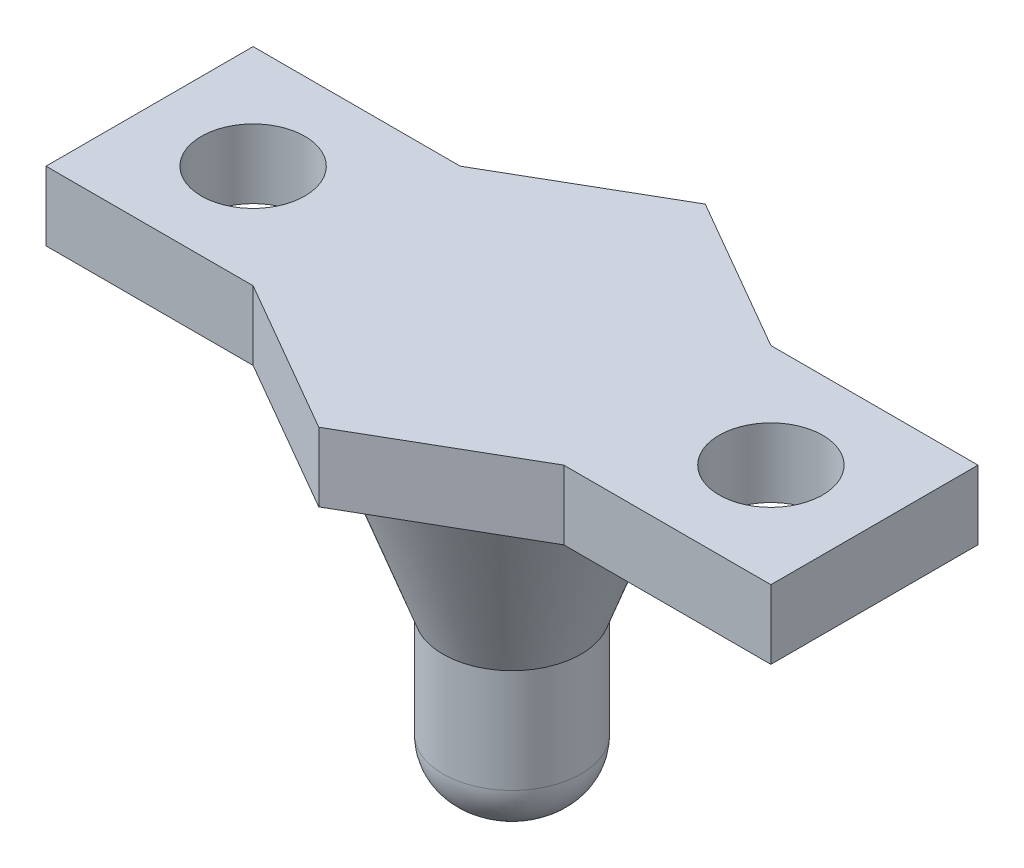
ISO-10303-21;
HEADER;
FILE_DESCRIPTION(('STEP AP214'),'2;1');
FILE_NAME('part.step','',(''),(''),'','','');
FILE_SCHEMA(('AUTOMOTIVE_DESIGN { 1 0 10303 214 1 1 1 1 }'));
ENDSEC;
DATA;
#1=APPLICATION_CONTEXT('core data for automotive mechanical design processes');
#2=APPLICATION_PROTOCOL_DEFINITION('international standard','automotive_design',2000,#1);
#3=PRODUCT_CONTEXT('',#1,'mechanical');
#4=PRODUCT('Part','Part','',(#3));
#5=PRODUCT_RELATED_PRODUCT_CATEGORY('part','',(#4));
#6=PRODUCT_DEFINITION_FORMATION('','',#4);
#7=PRODUCT_DEFINITION_CONTEXT('part definition',#1,'design');
#8=PRODUCT_DEFINITION('design','',#6,#7);
#9=PRODUCT_DEFINITION_SHAPE('','',#8);
#10=(LENGTH_UNIT() NAMED_UNIT(*) SI_UNIT(.MILLI.,.METRE.));
#11=(NAMED_UNIT(*) PLANE_ANGLE_UNIT() SI_UNIT($,.RADIAN.));
#12=(NAMED_UNIT(*) SI_UNIT($,.STERADIAN.) SOLID_ANGLE_UNIT());
#13=UNCERTAINTY_MEASURE_WITH_UNIT(LENGTH_MEASURE(1.E-05),#10,'distance_accuracy_value','');
#14=(GEOMETRIC_REPRESENTATION_CONTEXT(3) GLOBAL_UNCERTAINTY_ASSIGNED_CONTEXT((#13)) GLOBAL_UNIT_ASSIGNED_CONTEXT((#10,
#11,#12)) REPRESENTATION_CONTEXT('',''));
#15=CARTESIAN_POINT('',(0.,0.,0.));
#16=DIRECTION('',(0.,0.,1.));
#17=DIRECTION('',(1.,0.,0.));
#18=AXIS2_PLACEMENT_3D('',#15,#16,#17);
#19=CARTESIAN_POINT('',(0.,2.,0.));
#20=DIRECTION('',(0.,1.,0.));
#21=DIRECTION('',(0.,0.,1.));
#22=AXIS2_PLACEMENT_3D('',#19,#20,#21);
#23=PLANE('',#22);
#24=CARTESIAN_POINT('',(-7.5,2.,0.));
#25=DIRECTION('',(0.,1.,0.));
#26=DIRECTION('',(0.,0.,1.));
#27=AXIS2_PLACEMENT_3D('',#24,#25,#26);
#28=CIRCLE('',#27,1.5);
#29=CARTESIAN_POINT('',(-7.5,2.,1.5));
#30=VERTEX_POINT('',#29);
#31=EDGE_CURVE('E177',#30,#30,#28,.T.);
#32=ORIENTED_EDGE('',*,*,#31,.F.);
#33=EDGE_LOOP('',(#32));
#34=FACE_BOUND('',#33,.T.);
#35=DIRECTION('',(0.,0.,1.));
#36=VECTOR('',#35,1.);
#37=CARTESIAN_POINT('',(-10.5,2.,3.));
#38=LINE('',#37,#36);
#39=CARTESIAN_POINT('',(-10.5,2.,-3.));
#40=VERTEX_POINT('',#39);
#41=CARTESIAN_POINT('',(-10.5,2.,3.));
#42=VERTEX_POINT('',#41);
#43=EDGE_CURVE('E201',#40,#42,#38,.T.);
#44=ORIENTED_EDGE('',*,*,#43,.T.);
#45=DIRECTION('',(1.,0.,0.));
#46=VECTOR('',#45,1.);
#47=CARTESIAN_POINT('',(-4.5,2.,3.));
#48=LINE('',#47,#46);
#49=CARTESIAN_POINT('',(-4.5,2.,3.));
#50=VERTEX_POINT('',#49);
#51=EDGE_CURVE('E125',#42,#50,#48,.T.);
#52=ORIENTED_EDGE('',*,*,#51,.T.);
#53=DIRECTION('',(0.866025403784442,0.,0.499999999999995));
#54=VECTOR('',#53,1.);
#55=CARTESIAN_POINT('',(-4.5,2.,3.));
#56=LINE('',#55,#54);
#57=CARTESIAN_POINT('',(0.,2.,5.59807621135328));
#58=VERTEX_POINT('',#57);
#59=EDGE_CURVE('E251',#50,#58,#56,.T.);
#60=ORIENTED_EDGE('',*,*,#59,.T.);
#61=DIRECTION('',(0.866025403784442,0.,-0.499999999999995));
#62=VECTOR('',#61,1.);
#63=CARTESIAN_POINT('',(4.5,2.,3.));
#64=LINE('',#63,#62);
#65=CARTESIAN_POINT('',(4.5,2.,3.));
#66=VERTEX_POINT('',#65);
#67=EDGE_CURVE('E247',#58,#66,#64,.T.);
#68=ORIENTED_EDGE('',*,*,#67,.T.);
#69=DIRECTION('',(1.,0.,0.));
#70=VECTOR('',#69,1.);
#71=CARTESIAN_POINT('',(4.5,2.,3.));
#72=LINE('',#71,#70);
#73=CARTESIAN_POINT('',(10.5,2.,3.));
#74=VERTEX_POINT('',#73);
#75=EDGE_CURVE('E250',#66,#74,#72,.T.);
#76=ORIENTED_EDGE('',*,*,#75,.T.);
#77=DIRECTION('',(0.,0.,-1.));
#78=VECTOR('',#77,1.);
#79=CARTESIAN_POINT('',(10.5,2.,3.));
#80=LINE('',#79,#78);
#81=CARTESIAN_POINT('',(10.5,2.,-3.));
#82=VERTEX_POINT('',#81);
#83=EDGE_CURVE('E255',#74,#82,#80,.T.);
#84=ORIENTED_EDGE('',*,*,#83,.T.);
#85=DIRECTION('',(-1.,0.,0.));
#86=VECTOR('',#85,1.);
#87=CARTESIAN_POINT('',(4.5,2.,-3.));
#88=LINE('',#87,#86);
#89=CARTESIAN_POINT('',(4.5,2.,-3.));
#90=VERTEX_POINT('',#89);
#91=EDGE_CURVE('E150',#82,#90,#88,.T.);
#92=ORIENTED_EDGE('',*,*,#91,.T.);
#93=DIRECTION('',(-0.866025403784442,0.,-0.499999999999995));
#94=VECTOR('',#93,1.);
#95=CARTESIAN_POINT('',(4.5,2.,-3.));
#96=LINE('',#95,#94);
#97=CARTESIAN_POINT('',(0.,2.,-5.59807621135328));
#98=VERTEX_POINT('',#97);
#99=EDGE_CURVE('E144',#90,#98,#96,.T.);
#100=ORIENTED_EDGE('',*,*,#99,.T.);
#101=DIRECTION('',(-0.866025403784441,0.,0.499999999999995));
#102=VECTOR('',#101,1.);
#103=CARTESIAN_POINT('',(-4.5,2.,-3.));
#104=LINE('',#103,#102);
#105=CARTESIAN_POINT('',(-4.5,2.,-3.));
#106=VERTEX_POINT('',#105);
#107=EDGE_CURVE('E148',#98,#106,#104,.T.);
#108=ORIENTED_EDGE('',*,*,#107,.T.);
#109=DIRECTION('',(-1.,0.,0.));
#110=VECTOR('',#109,1.);
#111=CARTESIAN_POINT('',(-4.5,2.,-3.));
#112=LINE('',#111,#110);
#113=EDGE_CURVE('E75',#106,#40,#112,.T.);
#114=ORIENTED_EDGE('',*,*,#113,.T.);
#115=EDGE_LOOP('',(#44,#52,#60,#68,#76,#84,#92,#100,#108,#114));
#116=FACE_BOUND('',#115,.T.);
#117=CARTESIAN_POINT('',(7.5,2.,0.));
#118=DIRECTION('',(0.,1.,0.));
#119=DIRECTION('',(0.,0.,-1.));
#120=AXIS2_PLACEMENT_3D('',#117,#118,#119);
#121=CIRCLE('',#120,1.5);
#122=CARTESIAN_POINT('',(7.5,2.,-1.5));
#123=VERTEX_POINT('',#122);
#124=EDGE_CURVE('E452',#123,#123,#121,.T.);
#125=ORIENTED_EDGE('',*,*,#124,.F.);
#126=EDGE_LOOP('',(#125));
#127=FACE_BOUND('',#126,.T.);
#128=ADVANCED_FACE('F57',(#34,#116,#127),#23,.T.);
#129=CARTESIAN_POINT('',(0.,0.,0.));
#130=DIRECTION('',(0.,1.,0.));
#131=DIRECTION('',(0.,0.,1.));
#132=AXIS2_PLACEMENT_3D('',#129,#130,#131);
#133=PLANE('',#132);
#134=CARTESIAN_POINT('',(0.,0.,0.));
#135=DIRECTION('',(0.,1.,0.));
#136=DIRECTION('',(0.,0.,1.));
#137=AXIS2_PLACEMENT_3D('',#134,#135,#136);
#138=CIRCLE('',#137,4.);
#139=CARTESIAN_POINT('',(0.,0.,4.));
#140=VERTEX_POINT('',#139);
#141=EDGE_CURVE('E13',#140,#140,#138,.F.);
#142=ORIENTED_EDGE('',*,*,#141,.F.);
#143=EDGE_LOOP('',(#142));
#144=FACE_BOUND('',#143,.T.);
#145=DIRECTION('',(0.,0.,1.));
#146=VECTOR('',#145,1.);
#147=CARTESIAN_POINT('',(-10.5,0.,3.));
#148=LINE('',#147,#146);
#149=CARTESIAN_POINT('',(-10.5,0.,-3.));
#150=VERTEX_POINT('',#149);
#151=CARTESIAN_POINT('',(-10.5,0.,3.));
#152=VERTEX_POINT('',#151);
#153=EDGE_CURVE('E172',#150,#152,#148,.T.);
#154=ORIENTED_EDGE('',*,*,#153,.F.);
#155=DIRECTION('',(-1.,0.,0.));
#156=VECTOR('',#155,1.);
#157=CARTESIAN_POINT('',(-4.5,0.,-3.));
#158=LINE('',#157,#156);
#159=CARTESIAN_POINT('',(-4.5,0.,-3.));
#160=VERTEX_POINT('',#159);
#161=EDGE_CURVE('E116',#160,#150,#158,.T.);
#162=ORIENTED_EDGE('',*,*,#161,.F.);
#163=DIRECTION('',(-0.866025403784441,0.,0.499999999999995));
#164=VECTOR('',#163,1.);
#165=CARTESIAN_POINT('',(-4.5,0.,-3.));
#166=LINE('',#165,#164);
#167=CARTESIAN_POINT('',(0.,0.,-5.59807621135328));
#168=VERTEX_POINT('',#167);
#169=EDGE_CURVE('E110',#168,#160,#166,.T.);
#170=ORIENTED_EDGE('',*,*,#169,.F.);
#171=DIRECTION('',(-0.866025403784442,0.,-0.499999999999995));
#172=VECTOR('',#171,1.);
#173=CARTESIAN_POINT('',(4.5,0.,-3.));
#174=LINE('',#173,#172);
#175=CARTESIAN_POINT('',(4.5,0.,-3.));
#176=VERTEX_POINT('',#175);
#177=EDGE_CURVE('E159',#176,#168,#174,.T.);
#178=ORIENTED_EDGE('',*,*,#177,.F.);
#179=DIRECTION('',(-1.,0.,0.));
#180=VECTOR('',#179,1.);
#181=CARTESIAN_POINT('',(4.5,0.,-3.));
#182=LINE('',#181,#180);
#183=CARTESIAN_POINT('',(10.5,0.,-3.));
#184=VERTEX_POINT('',#183);
#185=EDGE_CURVE('E192',#184,#176,#182,.T.);
#186=ORIENTED_EDGE('',*,*,#185,.F.);
#187=DIRECTION('',(0.,0.,-1.));
#188=VECTOR('',#187,1.);
#189=CARTESIAN_POINT('',(10.5,0.,3.));
#190=LINE('',#189,#188);
#191=CARTESIAN_POINT('',(10.5,0.,3.));
#192=VERTEX_POINT('',#191);
#193=EDGE_CURVE('E189',#192,#184,#190,.T.);
#194=ORIENTED_EDGE('',*,*,#193,.F.);
#195=DIRECTION('',(1.,0.,0.));
#196=VECTOR('',#195,1.);
#197=CARTESIAN_POINT('',(4.5,0.,3.));
#198=LINE('',#197,#196);
#199=CARTESIAN_POINT('',(4.5,0.,3.));
#200=VERTEX_POINT('',#199);
#201=EDGE_CURVE('E186',#200,#192,#198,.T.);
#202=ORIENTED_EDGE('',*,*,#201,.F.);
#203=DIRECTION('',(0.866025403784442,0.,-0.499999999999995));
#204=VECTOR('',#203,1.);
#205=CARTESIAN_POINT('',(4.5,0.,3.));
#206=LINE('',#205,#204);
#207=CARTESIAN_POINT('',(0.,0.,5.59807621135328));
#208=VERTEX_POINT('',#207);
#209=EDGE_CURVE('E183',#208,#200,#206,.T.);
#210=ORIENTED_EDGE('',*,*,#209,.F.);
#211=DIRECTION('',(0.866025403784442,0.,0.499999999999995));
#212=VECTOR('',#211,1.);
#213=CARTESIAN_POINT('',(-4.5,0.,3.));
#214=LINE('',#213,#212);
#215=CARTESIAN_POINT('',(-4.5,0.,3.));
#216=VERTEX_POINT('',#215);
#217=EDGE_CURVE('E180',#216,#208,#214,.T.);
#218=ORIENTED_EDGE('',*,*,#217,.F.);
#219=DIRECTION('',(1.,0.,0.));
#220=VECTOR('',#219,1.);
#221=CARTESIAN_POINT('',(-4.5,0.,3.));
#222=LINE('',#221,#220);
#223=EDGE_CURVE('E176',#152,#216,#222,.T.);
#224=ORIENTED_EDGE('',*,*,#223,.F.);
#225=EDGE_LOOP('',(#154,#162,#170,#178,#186,#194,#202,#210,#218,#224));
#226=FACE_BOUND('',#225,.T.);
#227=CARTESIAN_POINT('',(-7.5,0.,0.));
#228=DIRECTION('',(0.,1.,0.));
#229=DIRECTION('',(0.,0.,1.));
#230=AXIS2_PLACEMENT_3D('',#227,#228,#229);
#231=CIRCLE('',#230,1.5);
#232=CARTESIAN_POINT('',(-7.5,0.,1.5));
#233=VERTEX_POINT('',#232);
#234=EDGE_CURVE('E456',#233,#233,#231,.T.);
#235=ORIENTED_EDGE('',*,*,#234,.T.);
#236=EDGE_LOOP('',(#235));
#237=FACE_BOUND('',#236,.T.);
#238=CARTESIAN_POINT('',(7.5,0.,0.));
#239=DIRECTION('',(0.,1.,0.));
#240=DIRECTION('',(0.,0.,-1.));
#241=AXIS2_PLACEMENT_3D('',#238,#239,#240);
#242=CIRCLE('',#241,1.5);
#243=CARTESIAN_POINT('',(7.5,0.,-1.5));
#244=VERTEX_POINT('',#243);
#245=EDGE_CURVE('E451',#244,#244,#242,.T.);
#246=ORIENTED_EDGE('',*,*,#245,.T.);
#247=EDGE_LOOP('',(#246));
#248=FACE_BOUND('',#247,.T.);
#249=ADVANCED_FACE('F234',(#144,#226,#237,#248),#133,.F.);
#250=CARTESIAN_POINT('',(-10.5,2.,3.));
#251=DIRECTION('',(1.,0.,0.));
#252=DIRECTION('',(0.,0.,-1.));
#253=AXIS2_PLACEMENT_3D('',#250,#251,#252);
#254=PLANE('',#253);
#255=ORIENTED_EDGE('',*,*,#153,.T.);
#256=DIRECTION('',(0.,-1.,0.));
#257=VECTOR('',#256,1.);
#258=CARTESIAN_POINT('',(-10.5,2.,3.));
#259=LINE('',#258,#257);
#260=EDGE_CURVE('E67',#42,#152,#259,.T.);
#261=ORIENTED_EDGE('',*,*,#260,.F.);
#262=ORIENTED_EDGE('',*,*,#43,.F.);
#263=DIRECTION('',(0.,-1.,0.));
#264=VECTOR('',#263,1.);
#265=CARTESIAN_POINT('',(-10.5,2.,-3.));
#266=LINE('',#265,#264);
#267=EDGE_CURVE('E168',#40,#150,#266,.T.);
#268=ORIENTED_EDGE('',*,*,#267,.T.);
#269=EDGE_LOOP('',(#255,#261,#262,#268));
#270=FACE_BOUND('',#269,.T.);
#271=ADVANCED_FACE('F59',(#270),#254,.F.);
#272=CARTESIAN_POINT('',(-4.5,2.,3.));
#273=DIRECTION('',(0.,0.,-1.));
#274=DIRECTION('',(-1.,0.,0.));
#275=AXIS2_PLACEMENT_3D('',#272,#273,#274);
#276=PLANE('',#275);
#277=ORIENTED_EDGE('',*,*,#223,.T.);
#278=DIRECTION('',(0.,-1.,0.));
#279=VECTOR('',#278,1.);
#280=CARTESIAN_POINT('',(-4.5,2.,3.));
#281=LINE('',#280,#279);
#282=EDGE_CURVE('E224',#50,#216,#281,.T.);
#283=ORIENTED_EDGE('',*,*,#282,.F.);
#284=ORIENTED_EDGE('',*,*,#51,.F.);
#285=ORIENTED_EDGE('',*,*,#260,.T.);
#286=EDGE_LOOP('',(#277,#283,#284,#285));
#287=FACE_BOUND('',#286,.T.);
#288=ADVANCED_FACE('F229',(#287),#276,.F.);
#289=CARTESIAN_POINT('',(-4.5,2.,3.));
#290=DIRECTION('',(0.499999999999995,0.,-0.866025403784442));
#291=DIRECTION('',(-0.866025403784442,0.,-0.499999999999995));
#292=AXIS2_PLACEMENT_3D('',#289,#290,#291);
#293=PLANE('',#292);
#294=ORIENTED_EDGE('',*,*,#217,.T.);
#295=DIRECTION('',(0.,-1.,0.));
#296=VECTOR('',#295,1.);
#297=CARTESIAN_POINT('',(0.,2.,5.59807621135328));
#298=LINE('',#297,#296);
#299=EDGE_CURVE('E220',#58,#208,#298,.T.);
#300=ORIENTED_EDGE('',*,*,#299,.F.);
#301=ORIENTED_EDGE('',*,*,#59,.F.);
#302=ORIENTED_EDGE('',*,*,#282,.T.);
#303=EDGE_LOOP('',(#294,#300,#301,#302));
#304=FACE_BOUND('',#303,.T.);
#305=ADVANCED_FACE('F241',(#304),#293,.F.);
#306=CARTESIAN_POINT('',(4.5,2.,3.));
#307=DIRECTION('',(-0.499999999999995,0.,-0.866025403784442));
#308=DIRECTION('',(-0.866025403784442,0.,0.499999999999995));
#309=AXIS2_PLACEMENT_3D('',#306,#307,#308);
#310=PLANE('',#309);
#311=ORIENTED_EDGE('',*,*,#209,.T.);
#312=DIRECTION('',(0.,-1.,0.));
#313=VECTOR('',#312,1.);
#314=CARTESIAN_POINT('',(4.5,2.,3.));
#315=LINE('',#314,#313);
#316=EDGE_CURVE('E216',#66,#200,#315,.T.);
#317=ORIENTED_EDGE('',*,*,#316,.F.);
#318=ORIENTED_EDGE('',*,*,#67,.F.);
#319=ORIENTED_EDGE('',*,*,#299,.T.);
#320=EDGE_LOOP('',(#311,#317,#318,#319));
#321=FACE_BOUND('',#320,.T.);
#322=ADVANCED_FACE('F245',(#321),#310,.F.);
#323=CARTESIAN_POINT('',(4.5,2.,3.));
#324=DIRECTION('',(0.,0.,-1.));
#325=DIRECTION('',(-1.,0.,0.));
#326=AXIS2_PLACEMENT_3D('',#323,#324,#325);
#327=PLANE('',#326);
#328=ORIENTED_EDGE('',*,*,#201,.T.);
#329=DIRECTION('',(0.,-1.,0.));
#330=VECTOR('',#329,1.);
#331=CARTESIAN_POINT('',(10.5,2.,3.));
#332=LINE('',#331,#330);
#333=EDGE_CURVE('E212',#74,#192,#332,.T.);
#334=ORIENTED_EDGE('',*,*,#333,.F.);
#335=ORIENTED_EDGE('',*,*,#75,.F.);
#336=ORIENTED_EDGE('',*,*,#316,.T.);
#337=EDGE_LOOP('',(#328,#334,#335,#336));
#338=FACE_BOUND('',#337,.T.);
#339=ADVANCED_FACE('F272',(#338),#327,.F.);
#340=CARTESIAN_POINT('',(10.5,2.,3.));
#341=DIRECTION('',(-1.,0.,0.));
#342=DIRECTION('',(0.,0.,1.));
#343=AXIS2_PLACEMENT_3D('',#340,#341,#342);
#344=PLANE('',#343);
#345=ORIENTED_EDGE('',*,*,#193,.T.);
#346=DIRECTION('',(0.,-1.,0.));
#347=VECTOR('',#346,1.);
#348=CARTESIAN_POINT('',(10.5,2.,-3.));
#349=LINE('',#348,#347);
#350=EDGE_CURVE('E208',#82,#184,#349,.T.);
#351=ORIENTED_EDGE('',*,*,#350,.F.);
#352=ORIENTED_EDGE('',*,*,#83,.F.);
#353=ORIENTED_EDGE('',*,*,#333,.T.);
#354=EDGE_LOOP('',(#345,#351,#352,#353));
#355=FACE_BOUND('',#354,.T.);
#356=ADVANCED_FACE('F266',(#355),#344,.F.);
#357=CARTESIAN_POINT('',(4.5,2.,-3.));
#358=DIRECTION('',(0.,0.,1.));
#359=DIRECTION('',(1.,0.,0.));
#360=AXIS2_PLACEMENT_3D('',#357,#358,#359);
#361=PLANE('',#360);
#362=ORIENTED_EDGE('',*,*,#185,.T.);
#363=DIRECTION('',(0.,-1.,0.));
#364=VECTOR('',#363,1.);
#365=CARTESIAN_POINT('',(4.5,2.,-3.));
#366=LINE('',#365,#364);
#367=EDGE_CURVE('E161',#90,#176,#366,.T.);
#368=ORIENTED_EDGE('',*,*,#367,.F.);
#369=ORIENTED_EDGE('',*,*,#91,.F.);
#370=ORIENTED_EDGE('',*,*,#350,.T.);
#371=EDGE_LOOP('',(#362,#368,#369,#370));
#372=FACE_BOUND('',#371,.T.);
#373=ADVANCED_FACE('F270',(#372),#361,.F.);
#374=CARTESIAN_POINT('',(4.5,2.,-3.));
#375=DIRECTION('',(-0.499999999999995,0.,0.866025403784442));
#376=DIRECTION('',(0.866025403784442,0.,0.499999999999995));
#377=AXIS2_PLACEMENT_3D('',#374,#375,#376);
#378=PLANE('',#377);
#379=ORIENTED_EDGE('',*,*,#177,.T.);
#380=DIRECTION('',(0.,-1.,0.));
#381=VECTOR('',#380,1.);
#382=CARTESIAN_POINT('',(0.,2.,-5.59807621135328));
#383=LINE('',#382,#381);
#384=EDGE_CURVE('E156',#98,#168,#383,.T.);
#385=ORIENTED_EDGE('',*,*,#384,.F.);
#386=ORIENTED_EDGE('',*,*,#99,.F.);
#387=ORIENTED_EDGE('',*,*,#367,.T.);
#388=EDGE_LOOP('',(#379,#385,#386,#387));
#389=FACE_BOUND('',#388,.T.);
#390=ADVANCED_FACE('F157',(#389),#378,.F.);
#391=CARTESIAN_POINT('',(-4.5,2.,-3.));
#392=DIRECTION('',(0.499999999999995,0.,0.866025403784441));
#393=DIRECTION('',(0.866025403784442,0.,-0.499999999999995));
#394=AXIS2_PLACEMENT_3D('',#391,#392,#393);
#395=PLANE('',#394);
#396=ORIENTED_EDGE('',*,*,#169,.T.);
#397=DIRECTION('',(0.,-1.,0.));
#398=VECTOR('',#397,1.);
#399=CARTESIAN_POINT('',(-4.5,2.,-3.));
#400=LINE('',#399,#398);
#401=EDGE_CURVE('E162',#106,#160,#400,.T.);
#402=ORIENTED_EDGE('',*,*,#401,.F.);
#403=ORIENTED_EDGE('',*,*,#107,.F.);
#404=ORIENTED_EDGE('',*,*,#384,.T.);
#405=EDGE_LOOP('',(#396,#402,#403,#404));
#406=FACE_BOUND('',#405,.T.);
#407=ADVANCED_FACE('F164',(#406),#395,.F.);
#408=CARTESIAN_POINT('',(-4.5,2.,-3.));
#409=DIRECTION('',(0.,0.,1.));
#410=DIRECTION('',(1.,0.,0.));
#411=AXIS2_PLACEMENT_3D('',#408,#409,#410);
#412=PLANE('',#411);
#413=ORIENTED_EDGE('',*,*,#161,.T.);
#414=ORIENTED_EDGE('',*,*,#267,.F.);
#415=ORIENTED_EDGE('',*,*,#113,.F.);
#416=ORIENTED_EDGE('',*,*,#401,.T.);
#417=EDGE_LOOP('',(#413,#414,#415,#416));
#418=FACE_BOUND('',#417,.T.);
#419=ADVANCED_FACE('F294',(#418),#412,.F.);
#420=CARTESIAN_POINT('',(-7.5,2.,0.));
#421=DIRECTION('',(0.,-1.,0.));
#422=DIRECTION('',(0.,0.,-1.));
#423=AXIS2_PLACEMENT_3D('',#420,#421,#422);
#424=CYLINDRICAL_SURFACE('',#423,1.5);
#425=ORIENTED_EDGE('',*,*,#31,.T.);
#426=EDGE_LOOP('',(#425));
#427=FACE_BOUND('',#426,.T.);
#428=ORIENTED_EDGE('',*,*,#234,.F.);
#429=EDGE_LOOP('',(#428));
#430=FACE_BOUND('',#429,.T.);
#431=ADVANCED_FACE('F291',(#427,#430),#424,.F.);
#432=CARTESIAN_POINT('',(7.5,2.,0.));
#433=DIRECTION('',(0.,-1.,0.));
#434=DIRECTION('',(0.,0.,-1.));
#435=AXIS2_PLACEMENT_3D('',#432,#433,#434);
#436=CYLINDRICAL_SURFACE('',#435,1.5);
#437=ORIENTED_EDGE('',*,*,#124,.T.);
#438=EDGE_LOOP('',(#437));
#439=FACE_BOUND('',#438,.T.);
#440=ORIENTED_EDGE('',*,*,#245,.F.);
#441=EDGE_LOOP('',(#440));
#442=FACE_BOUND('',#441,.T.);
#443=ADVANCED_FACE('F325',(#439,#442),#436,.F.);
#444=CARTESIAN_POINT('',(0.,-10.,0.));
#445=DIRECTION('',(0.,1.,0.));
#446=DIRECTION('',(-1.,0.,0.));
#447=AXIS2_PLACEMENT_3D('',#444,#445,#446);
#448=PLANE('',#447);
#449=CARTESIAN_POINT('',(0.,-10.,0.));
#450=DIRECTION('',(0.,1.,0.));
#451=DIRECTION('',(-1.,0.,0.));
#452=AXIS2_PLACEMENT_3D('',#449,#450,#451);
#453=CIRCLE('',#452,0.499999999999989);
#454=CARTESIAN_POINT('',(-0.499999999999988,-10.,0.));
#455=VERTEX_POINT('',#454);
#456=EDGE_CURVE('E445',#455,#455,#453,.T.);
#457=ORIENTED_EDGE('',*,*,#456,.F.);
#458=EDGE_LOOP('',(#457));
#459=FACE_BOUND('',#458,.T.);
#460=ADVANCED_FACE('F331',(#459),#448,.F.);
#461=CARTESIAN_POINT('',(0.,-8.5,0.));
#462=DIRECTION('',(0.,1.,0.));
#463=DIRECTION('',(-1.,0.,0.));
#464=AXIS2_PLACEMENT_3D('',#461,#462,#463);
#465=DEGENERATE_TOROIDAL_SURFACE('',#464,0.5,1.5,.T.);
#466=CARTESIAN_POINT('',(0.,-8.49999999999999,0.));
#467=DIRECTION('',(0.,1.,0.));
#468=DIRECTION('',(-1.,0.,0.));
#469=AXIS2_PLACEMENT_3D('',#466,#467,#468);
#470=CIRCLE('',#469,2.);
#471=CARTESIAN_POINT('',(-2.,-8.49999999999999,0.));
#472=VERTEX_POINT('',#471);
#473=EDGE_CURVE('E441',#472,#472,#470,.T.);
#474=ORIENTED_EDGE('',*,*,#473,.F.);
#475=EDGE_LOOP('',(#474));
#476=FACE_BOUND('',#475,.T.);
#477=ORIENTED_EDGE('',*,*,#456,.T.);
#478=EDGE_LOOP('',(#477));
#479=FACE_BOUND('',#478,.T.);
#480=ADVANCED_FACE('F338',(#476,#479),#465,.T.);
#481=CARTESIAN_POINT('',(0.,2.,0.));
#482=DIRECTION('',(0.,1.,0.));
#483=DIRECTION('',(-1.,0.,0.));
#484=AXIS2_PLACEMENT_3D('',#481,#482,#483);
#485=CYLINDRICAL_SURFACE('',#484,2.);
#486=CARTESIAN_POINT('',(0.,-5.49495483890918,0.));
#487=DIRECTION('',(0.,1.,0.));
#488=DIRECTION('',(-1.,0.,0.));
#489=AXIS2_PLACEMENT_3D('',#486,#487,#488);
#490=CIRCLE('',#489,2.);
#491=CARTESIAN_POINT('',(-2.,-5.49495483890918,0.));
#492=VERTEX_POINT('',#491);
#493=EDGE_CURVE('E439',#492,#492,#490,.T.);
#494=ORIENTED_EDGE('',*,*,#493,.F.);
#495=EDGE_LOOP('',(#494));
#496=FACE_BOUND('',#495,.T.);
#497=ORIENTED_EDGE('',*,*,#473,.T.);
#498=EDGE_LOOP('',(#497));
#499=FACE_BOUND('',#498,.T.);
#500=ADVANCED_FACE('F347',(#496,#499),#485,.T.);
#501=CARTESIAN_POINT('',(0.,-5.49495483890918,0.));
#502=DIRECTION('',(0.,1.,0.));
#503=DIRECTION('',(-1.,0.,0.));
#504=AXIS2_PLACEMENT_3D('',#501,#502,#503);
#505=CONICAL_SURFACE('',#504,2.,0.34906585039887);
#506=ORIENTED_EDGE('',*,*,#141,.T.);
#507=EDGE_LOOP('',(#506));
#508=FACE_BOUND('',#507,.T.);
#509=ORIENTED_EDGE('',*,*,#493,.T.);
#510=EDGE_LOOP('',(#509));
#511=FACE_BOUND('',#510,.T.);
#512=ADVANCED_FACE('F355',(#508,#511),#505,.T.);
#513=CLOSED_SHELL('',(#128,#249,#271,#288,#305,#322,#339,#356,#373,#390,#407,#419,#431,#443,
#460,#480,#500,#512));
#514=MANIFOLD_SOLID_BREP('B2',#513);
#515=ADVANCED_BREP_SHAPE_REPRESENTATION('',(#18,#514),#14);
#516=SHAPE_DEFINITION_REPRESENTATION(#9,#515);
ENDSEC;
END-ISO-10303-21;
